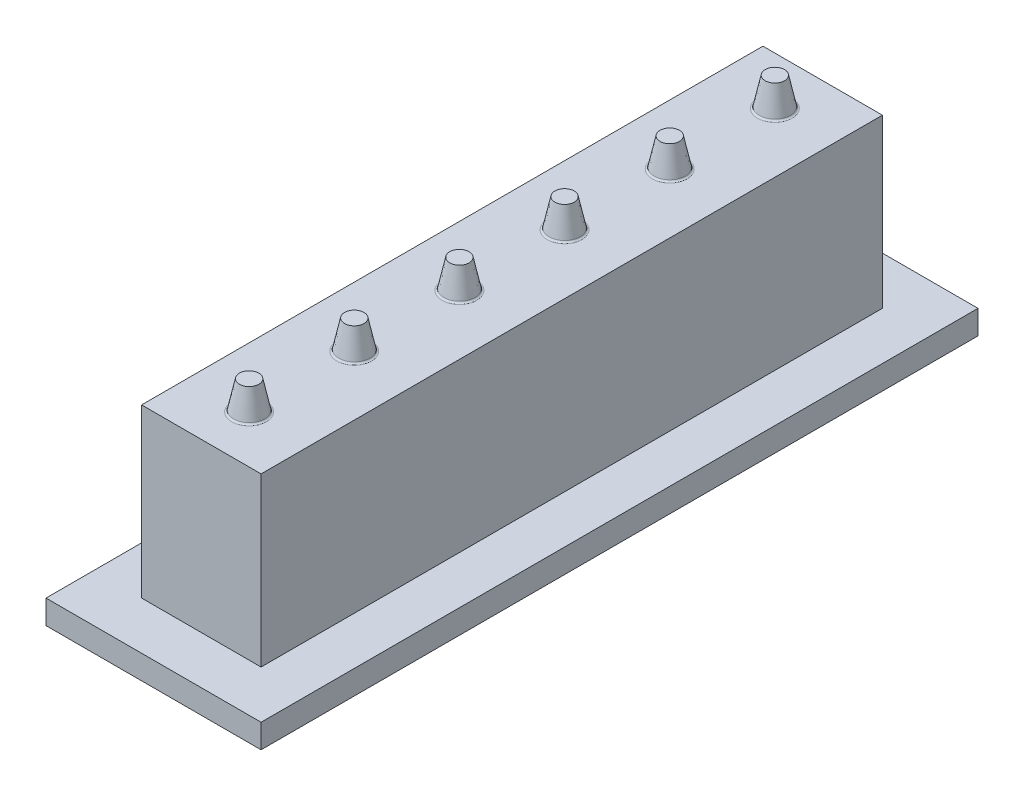
ISO-10303-21;
HEADER;
FILE_DESCRIPTION(('STEP AP214'),'2;1');
FILE_NAME('part.step','',(''),(''),'','','');
FILE_SCHEMA(('AUTOMOTIVE_DESIGN { 1 0 10303 214 1 1 1 1 }'));
ENDSEC;
DATA;
#1=APPLICATION_CONTEXT('core data for automotive mechanical design processes');
#2=APPLICATION_PROTOCOL_DEFINITION('international standard','automotive_design',2000,#1);
#3=PRODUCT_CONTEXT('',#1,'mechanical');
#4=PRODUCT('Part','Part','',(#3));
#5=PRODUCT_RELATED_PRODUCT_CATEGORY('part','',(#4));
#6=PRODUCT_DEFINITION_FORMATION('','',#4);
#7=PRODUCT_DEFINITION_CONTEXT('part definition',#1,'design');
#8=PRODUCT_DEFINITION('design','',#6,#7);
#9=PRODUCT_DEFINITION_SHAPE('','',#8);
#10=(LENGTH_UNIT() NAMED_UNIT(*) SI_UNIT(.MILLI.,.METRE.));
#11=(NAMED_UNIT(*) PLANE_ANGLE_UNIT() SI_UNIT($,.RADIAN.));
#12=(NAMED_UNIT(*) SI_UNIT($,.STERADIAN.) SOLID_ANGLE_UNIT());
#13=UNCERTAINTY_MEASURE_WITH_UNIT(LENGTH_MEASURE(1.E-05),#10,'distance_accuracy_value','');
#14=(GEOMETRIC_REPRESENTATION_CONTEXT(3) GLOBAL_UNCERTAINTY_ASSIGNED_CONTEXT((#13)) GLOBAL_UNIT_ASSIGNED_CONTEXT((#10,
#11,#12)) REPRESENTATION_CONTEXT('',''));
#15=CARTESIAN_POINT('',(0.,0.,0.));
#16=DIRECTION('',(0.,0.,1.));
#17=DIRECTION('',(1.,0.,0.));
#18=AXIS2_PLACEMENT_3D('',#15,#16,#17);
#19=CARTESIAN_POINT('',(0.,0.,165.1));
#20=DIRECTION('',(1.,0.,0.));
#21=DIRECTION('',(0.,0.,-1.));
#22=AXIS2_PLACEMENT_3D('',#19,#20,#21);
#23=PLANE('',#22);
#24=DIRECTION('',(0.,-1.,0.));
#25=VECTOR('',#24,1.);
#26=CARTESIAN_POINT('',(0.,0.,0.));
#27=LINE('',#26,#25);
#28=CARTESIAN_POINT('',(0.,50.8,0.));
#29=VERTEX_POINT('',#28);
#30=CARTESIAN_POINT('',(0.,6.35,0.));
#31=VERTEX_POINT('',#30);
#32=EDGE_CURVE('E219',#29,#31,#27,.T.);
#33=ORIENTED_EDGE('',*,*,#32,.T.);
#34=DIRECTION('',(0.,0.,-1.));
#35=VECTOR('',#34,1.);
#36=CARTESIAN_POINT('',(0.,6.35,0.));
#37=LINE('',#36,#35);
#38=CARTESIAN_POINT('',(0.,6.35,165.1));
#39=VERTEX_POINT('',#38);
#40=EDGE_CURVE('E57',#39,#31,#37,.T.);
#41=ORIENTED_EDGE('',*,*,#40,.F.);
#42=DIRECTION('',(0.,-1.,0.));
#43=VECTOR('',#42,1.);
#44=CARTESIAN_POINT('',(0.,0.,165.1));
#45=LINE('',#44,#43);
#46=CARTESIAN_POINT('',(0.,50.8,165.1));
#47=VERTEX_POINT('',#46);
#48=EDGE_CURVE('E220',#47,#39,#45,.T.);
#49=ORIENTED_EDGE('',*,*,#48,.F.);
#50=DIRECTION('',(0.,0.,-1.));
#51=VECTOR('',#50,1.);
#52=CARTESIAN_POINT('',(0.,50.8,165.1));
#53=LINE('',#52,#51);
#54=EDGE_CURVE('E227',#47,#29,#53,.T.);
#55=ORIENTED_EDGE('',*,*,#54,.T.);
#56=EDGE_LOOP('',(#33,#41,#49,#55));
#57=FACE_BOUND('',#56,.T.);
#58=ADVANCED_FACE('F34',(#57),#23,.F.);
#59=CARTESIAN_POINT('',(31.75,0.,165.1));
#60=DIRECTION('',(-1.,0.,0.));
#61=DIRECTION('',(0.,0.,1.));
#62=AXIS2_PLACEMENT_3D('',#59,#60,#61);
#63=PLANE('',#62);
#64=DIRECTION('',(0.,1.,0.));
#65=VECTOR('',#64,1.);
#66=CARTESIAN_POINT('',(31.75,0.,165.1));
#67=LINE('',#66,#65);
#68=CARTESIAN_POINT('',(31.75,6.35,165.1));
#69=VERTEX_POINT('',#68);
#70=CARTESIAN_POINT('',(31.75,50.8,165.1));
#71=VERTEX_POINT('',#70);
#72=EDGE_CURVE('E222',#69,#71,#67,.T.);
#73=ORIENTED_EDGE('',*,*,#72,.F.);
#74=DIRECTION('',(0.,0.,1.));
#75=VECTOR('',#74,1.);
#76=CARTESIAN_POINT('',(31.75,6.35,0.));
#77=LINE('',#76,#75);
#78=CARTESIAN_POINT('',(31.75,6.35,0.));
#79=VERTEX_POINT('',#78);
#80=EDGE_CURVE('E385',#79,#69,#77,.T.);
#81=ORIENTED_EDGE('',*,*,#80,.F.);
#82=DIRECTION('',(0.,1.,0.));
#83=VECTOR('',#82,1.);
#84=CARTESIAN_POINT('',(31.75,0.,0.));
#85=LINE('',#84,#83);
#86=CARTESIAN_POINT('',(31.75,50.8,0.));
#87=VERTEX_POINT('',#86);
#88=EDGE_CURVE('E229',#79,#87,#85,.T.);
#89=ORIENTED_EDGE('',*,*,#88,.T.);
#90=DIRECTION('',(0.,0.,-1.));
#91=VECTOR('',#90,1.);
#92=CARTESIAN_POINT('',(31.75,50.8,165.1));
#93=LINE('',#92,#91);
#94=EDGE_CURVE('E234',#71,#87,#93,.T.);
#95=ORIENTED_EDGE('',*,*,#94,.F.);
#96=EDGE_LOOP('',(#73,#81,#89,#95));
#97=FACE_BOUND('',#96,.T.);
#98=ADVANCED_FACE('F286',(#97),#63,.F.);
#99=CARTESIAN_POINT('',(0.,50.8,165.1));
#100=DIRECTION('',(0.,-1.,0.));
#101=DIRECTION('',(0.,0.,-1.));
#102=AXIS2_PLACEMENT_3D('',#99,#100,#101);
#103=PLANE('',#102);
#104=CARTESIAN_POINT('',(15.875,50.8,124.46));
#105=DIRECTION('',(0.,-1.,0.));
#106=DIRECTION('',(0.,0.,-1.));
#107=AXIS2_PLACEMENT_3D('',#104,#105,#106);
#108=CIRCLE('',#107,4.60237028886307);
#109=CARTESIAN_POINT('',(15.875,50.8,119.857629711137));
#110=VERTEX_POINT('',#109);
#111=EDGE_CURVE('E255',#110,#110,#108,.T.);
#112=ORIENTED_EDGE('',*,*,#111,.T.);
#113=EDGE_LOOP('',(#112));
#114=FACE_BOUND('',#113,.T.);
#115=CARTESIAN_POINT('',(15.875,50.8,152.4));
#116=DIRECTION('',(0.,-1.,0.));
#117=DIRECTION('',(0.,0.,-1.));
#118=AXIS2_PLACEMENT_3D('',#115,#116,#117);
#119=CIRCLE('',#118,4.60237028886307);
#120=CARTESIAN_POINT('',(15.875,50.8,147.797629711137));
#121=VERTEX_POINT('',#120);
#122=EDGE_CURVE('E252',#121,#121,#119,.T.);
#123=ORIENTED_EDGE('',*,*,#122,.T.);
#124=EDGE_LOOP('',(#123));
#125=FACE_BOUND('',#124,.T.);
#126=CARTESIAN_POINT('',(15.875,50.8,96.52));
#127=DIRECTION('',(0.,-1.,0.));
#128=DIRECTION('',(0.,0.,-1.));
#129=AXIS2_PLACEMENT_3D('',#126,#127,#128);
#130=CIRCLE('',#129,4.60237028886307);
#131=CARTESIAN_POINT('',(15.875,50.8,91.9176297111369));
#132=VERTEX_POINT('',#131);
#133=EDGE_CURVE('E249',#132,#132,#130,.T.);
#134=ORIENTED_EDGE('',*,*,#133,.T.);
#135=EDGE_LOOP('',(#134));
#136=FACE_BOUND('',#135,.T.);
#137=CARTESIAN_POINT('',(15.875,50.8,68.58));
#138=DIRECTION('',(0.,-1.,0.));
#139=DIRECTION('',(0.,0.,-1.));
#140=AXIS2_PLACEMENT_3D('',#137,#138,#139);
#141=CIRCLE('',#140,4.60237028886306);
#142=CARTESIAN_POINT('',(15.875,50.8,63.9776297111369));
#143=VERTEX_POINT('',#142);
#144=EDGE_CURVE('E246',#143,#143,#141,.T.);
#145=ORIENTED_EDGE('',*,*,#144,.T.);
#146=EDGE_LOOP('',(#145));
#147=FACE_BOUND('',#146,.T.);
#148=CARTESIAN_POINT('',(15.875,50.8,40.64));
#149=DIRECTION('',(0.,-1.,0.));
#150=DIRECTION('',(0.,0.,-1.));
#151=AXIS2_PLACEMENT_3D('',#148,#149,#150);
#152=CIRCLE('',#151,4.60237028886306);
#153=CARTESIAN_POINT('',(15.875,50.8,36.0376297111369));
#154=VERTEX_POINT('',#153);
#155=EDGE_CURVE('E243',#154,#154,#152,.T.);
#156=ORIENTED_EDGE('',*,*,#155,.T.);
#157=EDGE_LOOP('',(#156));
#158=FACE_BOUND('',#157,.T.);
#159=CARTESIAN_POINT('',(15.875,50.8,12.7));
#160=DIRECTION('',(0.,-1.,0.));
#161=DIRECTION('',(0.,0.,-1.));
#162=AXIS2_PLACEMENT_3D('',#159,#160,#161);
#163=CIRCLE('',#162,4.60237028886306);
#164=CARTESIAN_POINT('',(15.875,50.8,8.09762971113694));
#165=VERTEX_POINT('',#164);
#166=EDGE_CURVE('E240',#165,#165,#163,.T.);
#167=ORIENTED_EDGE('',*,*,#166,.T.);
#168=EDGE_LOOP('',(#167));
#169=FACE_BOUND('',#168,.T.);
#170=DIRECTION('',(-1.,0.,0.));
#171=VECTOR('',#170,1.);
#172=CARTESIAN_POINT('',(0.,50.8,0.));
#173=LINE('',#172,#171);
#174=EDGE_CURVE('E223',#87,#29,#173,.T.);
#175=ORIENTED_EDGE('',*,*,#174,.T.);
#176=ORIENTED_EDGE('',*,*,#54,.F.);
#177=DIRECTION('',(-1.,0.,0.));
#178=VECTOR('',#177,1.);
#179=CARTESIAN_POINT('',(0.,50.8,165.1));
#180=LINE('',#179,#178);
#181=EDGE_CURVE('E225',#71,#47,#180,.T.);
#182=ORIENTED_EDGE('',*,*,#181,.F.);
#183=ORIENTED_EDGE('',*,*,#94,.T.);
#184=EDGE_LOOP('',(#175,#176,#182,#183));
#185=FACE_BOUND('',#184,.T.);
#186=ADVANCED_FACE('F291',(#114,#125,#136,#147,#158,#169,#185),#103,.F.);
#187=CARTESIAN_POINT('',(0.,0.,165.1));
#188=DIRECTION('',(0.,0.,-1.));
#189=DIRECTION('',(-1.,0.,0.));
#190=AXIS2_PLACEMENT_3D('',#187,#188,#189);
#191=PLANE('',#190);
#192=ORIENTED_EDGE('',*,*,#48,.T.);
#193=DIRECTION('',(-1.,0.,0.));
#194=VECTOR('',#193,1.);
#195=CARTESIAN_POINT('',(0.,6.35,165.1));
#196=LINE('',#195,#194);
#197=EDGE_CURVE('E49',#69,#39,#196,.T.);
#198=ORIENTED_EDGE('',*,*,#197,.F.);
#199=ORIENTED_EDGE('',*,*,#72,.T.);
#200=ORIENTED_EDGE('',*,*,#181,.T.);
#201=EDGE_LOOP('',(#192,#198,#199,#200));
#202=FACE_BOUND('',#201,.T.);
#203=ADVANCED_FACE('F355',(#202),#191,.F.);
#204=CARTESIAN_POINT('',(0.,0.,0.));
#205=DIRECTION('',(0.,0.,-1.));
#206=DIRECTION('',(-1.,0.,0.));
#207=AXIS2_PLACEMENT_3D('',#204,#205,#206);
#208=PLANE('',#207);
#209=DIRECTION('',(1.,0.,0.));
#210=VECTOR('',#209,1.);
#211=CARTESIAN_POINT('',(0.,6.35,0.));
#212=LINE('',#211,#210);
#213=EDGE_CURVE('E381',#31,#79,#212,.T.);
#214=ORIENTED_EDGE('',*,*,#213,.F.);
#215=ORIENTED_EDGE('',*,*,#32,.F.);
#216=ORIENTED_EDGE('',*,*,#174,.F.);
#217=ORIENTED_EDGE('',*,*,#88,.F.);
#218=EDGE_LOOP('',(#214,#215,#216,#217));
#219=FACE_BOUND('',#218,.T.);
#220=ADVANCED_FACE('F353',(#219),#208,.T.);
#221=CARTESIAN_POINT('',(15.875,50.8,12.7));
#222=DIRECTION('',(0.,-1.,0.));
#223=DIRECTION('',(0.,0.,1.));
#224=AXIS2_PLACEMENT_3D('',#221,#222,#223);
#225=CONICAL_SURFACE('',#224,4.191,0.20943951023932);
#226=CARTESIAN_POINT('',(15.875,51.2023808610646,12.7));
#227=DIRECTION('',(0.,-1.,0.));
#228=DIRECTION('',(0.,0.,-1.));
#229=AXIS2_PLACEMENT_3D('',#226,#227,#228);
#230=CIRCLE('',#229,4.10547130769029);
#231=CARTESIAN_POINT('',(15.875,51.2023808610646,8.59452869230971));
#232=VERTEX_POINT('',#231);
#233=EDGE_CURVE('E11',#232,#232,#230,.F.);
#234=ORIENTED_EDGE('',*,*,#233,.T.);
#235=EDGE_LOOP('',(#234));
#236=FACE_BOUND('',#235,.T.);
#237=CARTESIAN_POINT('',(15.875,58.42,12.7));
#238=DIRECTION('',(0.,1.,0.));
#239=DIRECTION('',(0.,0.,1.));
#240=AXIS2_PLACEMENT_3D('',#237,#238,#239);
#241=CIRCLE('',#240,2.57131900007443);
#242=CARTESIAN_POINT('',(15.875,58.42,15.2713190000744));
#243=VERTEX_POINT('',#242);
#244=EDGE_CURVE('E216',#243,#243,#241,.T.);
#245=ORIENTED_EDGE('',*,*,#244,.F.);
#246=EDGE_LOOP('',(#245));
#247=FACE_BOUND('',#246,.T.);
#248=ADVANCED_FACE('F349',(#236,#247),#225,.T.);
#249=CARTESIAN_POINT('',(15.875,58.42,12.7));
#250=DIRECTION('',(0.,1.,0.));
#251=DIRECTION('',(0.,0.,1.));
#252=AXIS2_PLACEMENT_3D('',#249,#250,#251);
#253=PLANE('',#252);
#254=ORIENTED_EDGE('',*,*,#244,.T.);
#255=EDGE_LOOP('',(#254));
#256=FACE_BOUND('',#255,.T.);
#257=ADVANCED_FACE('F346',(#256),#253,.T.);
#258=CARTESIAN_POINT('',(15.875,50.8,40.64));
#259=DIRECTION('',(0.,-1.,0.));
#260=DIRECTION('',(0.,0.,1.));
#261=AXIS2_PLACEMENT_3D('',#258,#259,#260);
#262=CONICAL_SURFACE('',#261,4.191,0.20943951023932);
#263=CARTESIAN_POINT('',(15.875,51.2023808610646,40.64));
#264=DIRECTION('',(0.,-1.,0.));
#265=DIRECTION('',(0.,0.,-1.));
#266=AXIS2_PLACEMENT_3D('',#263,#264,#265);
#267=CIRCLE('',#266,4.10547130769029);
#268=CARTESIAN_POINT('',(15.875,51.2023808610646,36.5345286923097));
#269=VERTEX_POINT('',#268);
#270=EDGE_CURVE('E42',#269,#269,#267,.F.);
#271=ORIENTED_EDGE('',*,*,#270,.T.);
#272=EDGE_LOOP('',(#271));
#273=FACE_BOUND('',#272,.T.);
#274=CARTESIAN_POINT('',(15.875,58.42,40.64));
#275=DIRECTION('',(0.,1.,0.));
#276=DIRECTION('',(0.,0.,1.));
#277=AXIS2_PLACEMENT_3D('',#274,#275,#276);
#278=CIRCLE('',#277,2.57131900007443);
#279=CARTESIAN_POINT('',(15.875,58.42,43.2113190000744));
#280=VERTEX_POINT('',#279);
#281=EDGE_CURVE('E213',#280,#280,#278,.T.);
#282=ORIENTED_EDGE('',*,*,#281,.F.);
#283=EDGE_LOOP('',(#282));
#284=FACE_BOUND('',#283,.T.);
#285=ADVANCED_FACE('F269',(#273,#284),#262,.T.);
#286=CARTESIAN_POINT('',(15.875,58.42,40.64));
#287=DIRECTION('',(0.,1.,0.));
#288=DIRECTION('',(0.,0.,1.));
#289=AXIS2_PLACEMENT_3D('',#286,#287,#288);
#290=PLANE('',#289);
#291=ORIENTED_EDGE('',*,*,#281,.T.);
#292=EDGE_LOOP('',(#291));
#293=FACE_BOUND('',#292,.T.);
#294=ADVANCED_FACE('F339',(#293),#290,.T.);
#295=CARTESIAN_POINT('',(15.875,50.8,68.58));
#296=DIRECTION('',(0.,-1.,0.));
#297=DIRECTION('',(0.,0.,1.));
#298=AXIS2_PLACEMENT_3D('',#295,#296,#297);
#299=CONICAL_SURFACE('',#298,4.191,0.20943951023932);
#300=CARTESIAN_POINT('',(15.875,51.2023808610646,68.58));
#301=DIRECTION('',(0.,-1.,0.));
#302=DIRECTION('',(0.,0.,-1.));
#303=AXIS2_PLACEMENT_3D('',#300,#301,#302);
#304=CIRCLE('',#303,4.10547130769029);
#305=CARTESIAN_POINT('',(15.875,51.2023808610646,64.4745286923097));
#306=VERTEX_POINT('',#305);
#307=EDGE_CURVE('E264',#306,#306,#304,.F.);
#308=ORIENTED_EDGE('',*,*,#307,.T.);
#309=EDGE_LOOP('',(#308));
#310=FACE_BOUND('',#309,.T.);
#311=CARTESIAN_POINT('',(15.875,58.42,68.58));
#312=DIRECTION('',(0.,1.,0.));
#313=DIRECTION('',(0.,0.,1.));
#314=AXIS2_PLACEMENT_3D('',#311,#312,#313);
#315=CIRCLE('',#314,2.57131900007443);
#316=CARTESIAN_POINT('',(15.875,58.42,71.1513190000744));
#317=VERTEX_POINT('',#316);
#318=EDGE_CURVE('E210',#317,#317,#315,.T.);
#319=ORIENTED_EDGE('',*,*,#318,.F.);
#320=EDGE_LOOP('',(#319));
#321=FACE_BOUND('',#320,.T.);
#322=ADVANCED_FACE('F335',(#310,#321),#299,.T.);
#323=CARTESIAN_POINT('',(15.875,58.42,68.58));
#324=DIRECTION('',(0.,1.,0.));
#325=DIRECTION('',(0.,0.,1.));
#326=AXIS2_PLACEMENT_3D('',#323,#324,#325);
#327=PLANE('',#326);
#328=ORIENTED_EDGE('',*,*,#318,.T.);
#329=EDGE_LOOP('',(#328));
#330=FACE_BOUND('',#329,.T.);
#331=ADVANCED_FACE('F318',(#330),#327,.T.);
#332=CARTESIAN_POINT('',(15.875,50.8,96.52));
#333=DIRECTION('',(0.,-1.,0.));
#334=DIRECTION('',(0.,0.,1.));
#335=AXIS2_PLACEMENT_3D('',#332,#333,#334);
#336=CONICAL_SURFACE('',#335,4.19100000000001,0.20943951023932);
#337=CARTESIAN_POINT('',(15.875,51.2023808610646,96.52));
#338=DIRECTION('',(0.,-1.,0.));
#339=DIRECTION('',(0.,0.,-1.));
#340=AXIS2_PLACEMENT_3D('',#337,#338,#339);
#341=CIRCLE('',#340,4.1054713076903);
#342=CARTESIAN_POINT('',(15.875,51.2023808610646,92.4145286923097));
#343=VERTEX_POINT('',#342);
#344=EDGE_CURVE('E261',#343,#343,#341,.F.);
#345=ORIENTED_EDGE('',*,*,#344,.T.);
#346=EDGE_LOOP('',(#345));
#347=FACE_BOUND('',#346,.T.);
#348=CARTESIAN_POINT('',(15.875,58.42,96.52));
#349=DIRECTION('',(0.,1.,0.));
#350=DIRECTION('',(0.,0.,1.));
#351=AXIS2_PLACEMENT_3D('',#348,#349,#350);
#352=CIRCLE('',#351,2.57131900007444);
#353=CARTESIAN_POINT('',(15.875,58.42,99.0913190000744));
#354=VERTEX_POINT('',#353);
#355=EDGE_CURVE('E207',#354,#354,#352,.T.);
#356=ORIENTED_EDGE('',*,*,#355,.F.);
#357=EDGE_LOOP('',(#356));
#358=FACE_BOUND('',#357,.T.);
#359=ADVANCED_FACE('F314',(#347,#358),#336,.T.);
#360=CARTESIAN_POINT('',(15.875,58.42,96.52));
#361=DIRECTION('',(0.,1.,0.));
#362=DIRECTION('',(0.,0.,1.));
#363=AXIS2_PLACEMENT_3D('',#360,#361,#362);
#364=PLANE('',#363);
#365=ORIENTED_EDGE('',*,*,#355,.T.);
#366=EDGE_LOOP('',(#365));
#367=FACE_BOUND('',#366,.T.);
#368=ADVANCED_FACE('F317',(#367),#364,.T.);
#369=CARTESIAN_POINT('',(15.875,50.8,124.46));
#370=DIRECTION('',(0.,-1.,0.));
#371=DIRECTION('',(0.,0.,1.));
#372=AXIS2_PLACEMENT_3D('',#369,#370,#371);
#373=CONICAL_SURFACE('',#372,4.19100000000001,0.20943951023932);
#374=CARTESIAN_POINT('',(15.875,51.2023808610646,124.46));
#375=DIRECTION('',(0.,-1.,0.));
#376=DIRECTION('',(0.,0.,-1.));
#377=AXIS2_PLACEMENT_3D('',#374,#375,#376);
#378=CIRCLE('',#377,4.10547130769029);
#379=CARTESIAN_POINT('',(15.875,51.2023808610646,120.35452869231));
#380=VERTEX_POINT('',#379);
#381=EDGE_CURVE('E237',#380,#380,#378,.F.);
#382=ORIENTED_EDGE('',*,*,#381,.T.);
#383=EDGE_LOOP('',(#382));
#384=FACE_BOUND('',#383,.T.);
#385=CARTESIAN_POINT('',(15.875,58.42,124.46));
#386=DIRECTION('',(0.,1.,0.));
#387=DIRECTION('',(0.,0.,1.));
#388=AXIS2_PLACEMENT_3D('',#385,#386,#387);
#389=CIRCLE('',#388,2.57131900007443);
#390=CARTESIAN_POINT('',(15.875,58.42,127.031319000074));
#391=VERTEX_POINT('',#390);
#392=EDGE_CURVE('E204',#391,#391,#389,.T.);
#393=ORIENTED_EDGE('',*,*,#392,.F.);
#394=EDGE_LOOP('',(#393));
#395=FACE_BOUND('',#394,.T.);
#396=ADVANCED_FACE('F323',(#384,#395),#373,.T.);
#397=CARTESIAN_POINT('',(15.875,58.42,124.46));
#398=DIRECTION('',(0.,1.,0.));
#399=DIRECTION('',(0.,0.,1.));
#400=AXIS2_PLACEMENT_3D('',#397,#398,#399);
#401=PLANE('',#400);
#402=ORIENTED_EDGE('',*,*,#392,.T.);
#403=EDGE_LOOP('',(#402));
#404=FACE_BOUND('',#403,.T.);
#405=ADVANCED_FACE('F328',(#404),#401,.T.);
#406=CARTESIAN_POINT('',(15.875,50.8,152.4));
#407=DIRECTION('',(0.,-1.,0.));
#408=DIRECTION('',(0.,0.,1.));
#409=AXIS2_PLACEMENT_3D('',#406,#407,#408);
#410=CONICAL_SURFACE('',#409,4.19100000000001,0.20943951023932);
#411=CARTESIAN_POINT('',(15.875,51.2023808610646,152.4));
#412=DIRECTION('',(0.,-1.,0.));
#413=DIRECTION('',(0.,0.,-1.));
#414=AXIS2_PLACEMENT_3D('',#411,#412,#413);
#415=CIRCLE('',#414,4.1054713076903);
#416=CARTESIAN_POINT('',(15.875,51.2023808610646,148.29452869231));
#417=VERTEX_POINT('',#416);
#418=EDGE_CURVE('E258',#417,#417,#415,.F.);
#419=ORIENTED_EDGE('',*,*,#418,.T.);
#420=EDGE_LOOP('',(#419));
#421=FACE_BOUND('',#420,.T.);
#422=CARTESIAN_POINT('',(15.875,58.42,152.4));
#423=DIRECTION('',(0.,1.,0.));
#424=DIRECTION('',(0.,0.,1.));
#425=AXIS2_PLACEMENT_3D('',#422,#423,#424);
#426=CIRCLE('',#425,2.57131900007444);
#427=CARTESIAN_POINT('',(15.875,58.42,154.971319000074));
#428=VERTEX_POINT('',#427);
#429=EDGE_CURVE('E195',#428,#428,#426,.T.);
#430=ORIENTED_EDGE('',*,*,#429,.F.);
#431=EDGE_LOOP('',(#430));
#432=FACE_BOUND('',#431,.T.);
#433=ADVANCED_FACE('F427',(#421,#432),#410,.T.);
#434=CARTESIAN_POINT('',(15.875,58.42,152.4));
#435=DIRECTION('',(0.,1.,0.));
#436=DIRECTION('',(0.,0.,1.));
#437=AXIS2_PLACEMENT_3D('',#434,#435,#436);
#438=PLANE('',#437);
#439=ORIENTED_EDGE('',*,*,#429,.T.);
#440=EDGE_LOOP('',(#439));
#441=FACE_BOUND('',#440,.T.);
#442=ADVANCED_FACE('F301',(#441),#438,.T.);
#443=CARTESIAN_POINT('',(15.875,51.308,124.46));
#444=DIRECTION('',(0.,-1.,0.));
#445=DIRECTION('',(0.,0.,-1.));
#446=AXIS2_PLACEMENT_3D('',#443,#444,#445);
#447=TOROIDAL_SURFACE('',#446,4.60237028886307,0.508);
#448=ORIENTED_EDGE('',*,*,#111,.F.);
#449=EDGE_LOOP('',(#448));
#450=FACE_BOUND('',#449,.T.);
#451=ORIENTED_EDGE('',*,*,#381,.F.);
#452=EDGE_LOOP('',(#451));
#453=FACE_BOUND('',#452,.T.);
#454=ADVANCED_FACE('F297',(#450,#453),#447,.F.);
#455=CARTESIAN_POINT('',(15.875,51.308,152.4));
#456=DIRECTION('',(0.,-1.,0.));
#457=DIRECTION('',(0.,0.,-1.));
#458=AXIS2_PLACEMENT_3D('',#455,#456,#457);
#459=TOROIDAL_SURFACE('',#458,4.60237028886307,0.508);
#460=ORIENTED_EDGE('',*,*,#122,.F.);
#461=EDGE_LOOP('',(#460));
#462=FACE_BOUND('',#461,.T.);
#463=ORIENTED_EDGE('',*,*,#418,.F.);
#464=EDGE_LOOP('',(#463));
#465=FACE_BOUND('',#464,.T.);
#466=ADVANCED_FACE('F300',(#462,#465),#459,.F.);
#467=CARTESIAN_POINT('',(15.875,51.308,96.52));
#468=DIRECTION('',(0.,-1.,0.));
#469=DIRECTION('',(0.,0.,-1.));
#470=AXIS2_PLACEMENT_3D('',#467,#468,#469);
#471=TOROIDAL_SURFACE('',#470,4.60237028886307,0.508);
#472=ORIENTED_EDGE('',*,*,#133,.F.);
#473=EDGE_LOOP('',(#472));
#474=FACE_BOUND('',#473,.T.);
#475=ORIENTED_EDGE('',*,*,#344,.F.);
#476=EDGE_LOOP('',(#475));
#477=FACE_BOUND('',#476,.T.);
#478=ADVANCED_FACE('F281',(#474,#477),#471,.F.);
#479=CARTESIAN_POINT('',(15.875,51.308,68.58));
#480=DIRECTION('',(0.,-1.,0.));
#481=DIRECTION('',(0.,0.,-1.));
#482=AXIS2_PLACEMENT_3D('',#479,#480,#481);
#483=TOROIDAL_SURFACE('',#482,4.60237028886306,0.508);
#484=ORIENTED_EDGE('',*,*,#144,.F.);
#485=EDGE_LOOP('',(#484));
#486=FACE_BOUND('',#485,.T.);
#487=ORIENTED_EDGE('',*,*,#307,.F.);
#488=EDGE_LOOP('',(#487));
#489=FACE_BOUND('',#488,.T.);
#490=ADVANCED_FACE('F274',(#486,#489),#483,.F.);
#491=CARTESIAN_POINT('',(15.875,51.308,40.64));
#492=DIRECTION('',(0.,-1.,0.));
#493=DIRECTION('',(0.,0.,-1.));
#494=AXIS2_PLACEMENT_3D('',#491,#492,#493);
#495=TOROIDAL_SURFACE('',#494,4.60237028886306,0.508);
#496=ORIENTED_EDGE('',*,*,#155,.F.);
#497=EDGE_LOOP('',(#496));
#498=FACE_BOUND('',#497,.T.);
#499=ORIENTED_EDGE('',*,*,#270,.F.);
#500=EDGE_LOOP('',(#499));
#501=FACE_BOUND('',#500,.T.);
#502=ADVANCED_FACE('F272',(#498,#501),#495,.F.);
#503=CARTESIAN_POINT('',(15.875,51.308,12.7));
#504=DIRECTION('',(0.,-1.,0.));
#505=DIRECTION('',(0.,0.,-1.));
#506=AXIS2_PLACEMENT_3D('',#503,#504,#505);
#507=TOROIDAL_SURFACE('',#506,4.60237028886306,0.508);
#508=ORIENTED_EDGE('',*,*,#166,.F.);
#509=EDGE_LOOP('',(#508));
#510=FACE_BOUND('',#509,.T.);
#511=ORIENTED_EDGE('',*,*,#233,.F.);
#512=EDGE_LOOP('',(#511));
#513=FACE_BOUND('',#512,.T.);
#514=ADVANCED_FACE('F36',(#510,#513),#507,.F.);
#515=CARTESIAN_POINT('',(-12.7,6.35,-12.7));
#516=DIRECTION('',(-1.,0.,0.));
#517=DIRECTION('',(0.,0.,1.));
#518=AXIS2_PLACEMENT_3D('',#515,#516,#517);
#519=PLANE('',#518);
#520=DIRECTION('',(0.,0.,-1.));
#521=VECTOR('',#520,1.);
#522=CARTESIAN_POINT('',(-12.7,0.,-12.7));
#523=LINE('',#522,#521);
#524=CARTESIAN_POINT('',(-12.7,0.,177.8));
#525=VERTEX_POINT('',#524);
#526=CARTESIAN_POINT('',(-12.7,0.,-12.7));
#527=VERTEX_POINT('',#526);
#528=EDGE_CURVE('E160',#525,#527,#523,.T.);
#529=ORIENTED_EDGE('',*,*,#528,.F.);
#530=DIRECTION('',(0.,-1.,0.));
#531=VECTOR('',#530,1.);
#532=CARTESIAN_POINT('',(-12.7,6.35,177.8));
#533=LINE('',#532,#531);
#534=CARTESIAN_POINT('',(-12.7,6.35,177.8));
#535=VERTEX_POINT('',#534);
#536=EDGE_CURVE('E149',#535,#525,#533,.T.);
#537=ORIENTED_EDGE('',*,*,#536,.F.);
#538=DIRECTION('',(0.,0.,-1.));
#539=VECTOR('',#538,1.);
#540=CARTESIAN_POINT('',(-12.7,6.35,-12.7));
#541=LINE('',#540,#539);
#542=CARTESIAN_POINT('',(-12.7,6.35,-12.7));
#543=VERTEX_POINT('',#542);
#544=EDGE_CURVE('E143',#535,#543,#541,.T.);
#545=ORIENTED_EDGE('',*,*,#544,.T.);
#546=DIRECTION('',(0.,-1.,0.));
#547=VECTOR('',#546,1.);
#548=CARTESIAN_POINT('',(-12.7,6.35,-12.7));
#549=LINE('',#548,#547);
#550=EDGE_CURVE('E125',#543,#527,#549,.T.);
#551=ORIENTED_EDGE('',*,*,#550,.T.);
#552=EDGE_LOOP('',(#529,#537,#545,#551));
#553=FACE_BOUND('',#552,.T.);
#554=ADVANCED_FACE('F148',(#553),#519,.T.);
#555=CARTESIAN_POINT('',(-12.7,6.35,177.8));
#556=DIRECTION('',(0.,0.,1.));
#557=DIRECTION('',(1.,0.,0.));
#558=AXIS2_PLACEMENT_3D('',#555,#556,#557);
#559=PLANE('',#558);
#560=DIRECTION('',(-1.,0.,0.));
#561=VECTOR('',#560,1.);
#562=CARTESIAN_POINT('',(-12.7,0.,177.8));
#563=LINE('',#562,#561);
#564=CARTESIAN_POINT('',(44.45,0.,177.8));
#565=VERTEX_POINT('',#564);
#566=EDGE_CURVE('E150',#565,#525,#563,.T.);
#567=ORIENTED_EDGE('',*,*,#566,.F.);
#568=DIRECTION('',(0.,-1.,0.));
#569=VECTOR('',#568,1.);
#570=CARTESIAN_POINT('',(44.45,6.35,177.8));
#571=LINE('',#570,#569);
#572=CARTESIAN_POINT('',(44.45,6.35,177.8));
#573=VERTEX_POINT('',#572);
#574=EDGE_CURVE('E167',#573,#565,#571,.T.);
#575=ORIENTED_EDGE('',*,*,#574,.F.);
#576=DIRECTION('',(-1.,0.,0.));
#577=VECTOR('',#576,1.);
#578=CARTESIAN_POINT('',(-12.7,6.35,177.8));
#579=LINE('',#578,#577);
#580=EDGE_CURVE('E136',#573,#535,#579,.T.);
#581=ORIENTED_EDGE('',*,*,#580,.T.);
#582=ORIENTED_EDGE('',*,*,#536,.T.);
#583=EDGE_LOOP('',(#567,#575,#581,#582));
#584=FACE_BOUND('',#583,.T.);
#585=ADVANCED_FACE('F401',(#584),#559,.T.);
#586=CARTESIAN_POINT('',(44.45,6.35,-12.7));
#587=DIRECTION('',(1.,0.,0.));
#588=DIRECTION('',(0.,0.,-1.));
#589=AXIS2_PLACEMENT_3D('',#586,#587,#588);
#590=PLANE('',#589);
#591=DIRECTION('',(0.,0.,1.));
#592=VECTOR('',#591,1.);
#593=CARTESIAN_POINT('',(44.45,0.,-12.7));
#594=LINE('',#593,#592);
#595=CARTESIAN_POINT('',(44.45,0.,-12.7));
#596=VERTEX_POINT('',#595);
#597=EDGE_CURVE('E153',#596,#565,#594,.T.);
#598=ORIENTED_EDGE('',*,*,#597,.F.);
#599=DIRECTION('',(0.,-1.,0.));
#600=VECTOR('',#599,1.);
#601=CARTESIAN_POINT('',(44.45,6.35,-12.7));
#602=LINE('',#601,#600);
#603=CARTESIAN_POINT('',(44.45,6.35,-12.7));
#604=VERTEX_POINT('',#603);
#605=EDGE_CURVE('E135',#604,#596,#602,.T.);
#606=ORIENTED_EDGE('',*,*,#605,.F.);
#607=DIRECTION('',(0.,0.,1.));
#608=VECTOR('',#607,1.);
#609=CARTESIAN_POINT('',(44.45,6.35,-12.7));
#610=LINE('',#609,#608);
#611=EDGE_CURVE('E146',#604,#573,#610,.T.);
#612=ORIENTED_EDGE('',*,*,#611,.T.);
#613=ORIENTED_EDGE('',*,*,#574,.T.);
#614=EDGE_LOOP('',(#598,#606,#612,#613));
#615=FACE_BOUND('',#614,.T.);
#616=ADVANCED_FACE('F398',(#615),#590,.T.);
#617=CARTESIAN_POINT('',(-12.7,6.35,-12.7));
#618=DIRECTION('',(0.,0.,-1.));
#619=DIRECTION('',(-1.,0.,0.));
#620=AXIS2_PLACEMENT_3D('',#617,#618,#619);
#621=PLANE('',#620);
#622=DIRECTION('',(1.,0.,0.));
#623=VECTOR('',#622,1.);
#624=CARTESIAN_POINT('',(-12.7,0.,-12.7));
#625=LINE('',#624,#623);
#626=EDGE_CURVE('E130',#527,#596,#625,.T.);
#627=ORIENTED_EDGE('',*,*,#626,.F.);
#628=ORIENTED_EDGE('',*,*,#550,.F.);
#629=DIRECTION('',(1.,0.,0.));
#630=VECTOR('',#629,1.);
#631=CARTESIAN_POINT('',(-12.7,6.35,-12.7));
#632=LINE('',#631,#630);
#633=EDGE_CURVE('E128',#543,#604,#632,.T.);
#634=ORIENTED_EDGE('',*,*,#633,.T.);
#635=ORIENTED_EDGE('',*,*,#605,.T.);
#636=EDGE_LOOP('',(#627,#628,#634,#635));
#637=FACE_BOUND('',#636,.T.);
#638=ADVANCED_FACE('F127',(#637),#621,.T.);
#639=CARTESIAN_POINT('',(0.,6.35,0.));
#640=DIRECTION('',(0.,1.,0.));
#641=DIRECTION('',(0.,0.,1.));
#642=AXIS2_PLACEMENT_3D('',#639,#640,#641);
#643=PLANE('',#642);
#644=ORIENTED_EDGE('',*,*,#40,.T.);
#645=ORIENTED_EDGE('',*,*,#213,.T.);
#646=ORIENTED_EDGE('',*,*,#80,.T.);
#647=ORIENTED_EDGE('',*,*,#197,.T.);
#648=EDGE_LOOP('',(#644,#645,#646,#647));
#649=FACE_BOUND('',#648,.T.);
#650=ORIENTED_EDGE('',*,*,#544,.F.);
#651=ORIENTED_EDGE('',*,*,#580,.F.);
#652=ORIENTED_EDGE('',*,*,#611,.F.);
#653=ORIENTED_EDGE('',*,*,#633,.F.);
#654=EDGE_LOOP('',(#650,#651,#652,#653));
#655=FACE_BOUND('',#654,.T.);
#656=ADVANCED_FACE('F141',(#649,#655),#643,.T.);
#657=CARTESIAN_POINT('',(0.,44.45,0.));
#658=DIRECTION('',(0.,1.,0.));
#659=DIRECTION('',(0.,0.,1.));
#660=AXIS2_PLACEMENT_3D('',#657,#658,#659);
#661=PLANE('',#660);
#662=DIRECTION('',(0.,0.,-1.));
#663=VECTOR('',#662,1.);
#664=CARTESIAN_POINT('',(6.35,44.45,6.35));
#665=LINE('',#664,#663);
#666=CARTESIAN_POINT('',(6.34999999999998,44.45,158.75));
#667=VERTEX_POINT('',#666);
#668=CARTESIAN_POINT('',(6.35,44.45,6.35));
#669=VERTEX_POINT('',#668);
#670=EDGE_CURVE('E170',#667,#669,#665,.T.);
#671=ORIENTED_EDGE('',*,*,#670,.T.);
#672=DIRECTION('',(1.,0.,0.));
#673=VECTOR('',#672,1.);
#674=CARTESIAN_POINT('',(6.35,44.45,6.35));
#675=LINE('',#674,#673);
#676=CARTESIAN_POINT('',(25.4,44.45,6.35));
#677=VERTEX_POINT('',#676);
#678=EDGE_CURVE('E173',#669,#677,#675,.T.);
#679=ORIENTED_EDGE('',*,*,#678,.T.);
#680=DIRECTION('',(0.,0.,1.));
#681=VECTOR('',#680,1.);
#682=CARTESIAN_POINT('',(25.4,44.45,6.35));
#683=LINE('',#682,#681);
#684=CARTESIAN_POINT('',(25.4,44.45,158.75));
#685=VERTEX_POINT('',#684);
#686=EDGE_CURVE('E177',#677,#685,#683,.T.);
#687=ORIENTED_EDGE('',*,*,#686,.T.);
#688=DIRECTION('',(-1.,0.,0.));
#689=VECTOR('',#688,1.);
#690=CARTESIAN_POINT('',(6.34999999999998,44.45,158.75));
#691=LINE('',#690,#689);
#692=EDGE_CURVE('E180',#685,#667,#691,.T.);
#693=ORIENTED_EDGE('',*,*,#692,.T.);
#694=EDGE_LOOP('',(#671,#679,#687,#693));
#695=FACE_BOUND('',#694,.T.);
#696=ADVANCED_FACE('F389',(#695),#661,.F.);
#697=CARTESIAN_POINT('',(25.4,44.45,6.35));
#698=DIRECTION('',(1.,0.,0.));
#699=DIRECTION('',(0.,0.,-1.));
#700=AXIS2_PLACEMENT_3D('',#697,#698,#699);
#701=PLANE('',#700);
#702=DIRECTION('',(0.,0.,1.));
#703=VECTOR('',#702,1.);
#704=CARTESIAN_POINT('',(25.4,0.,6.35));
#705=LINE('',#704,#703);
#706=CARTESIAN_POINT('',(25.4,0.,6.35));
#707=VERTEX_POINT('',#706);
#708=CARTESIAN_POINT('',(25.4,0.,158.75));
#709=VERTEX_POINT('',#708);
#710=EDGE_CURVE('E188',#707,#709,#705,.T.);
#711=ORIENTED_EDGE('',*,*,#710,.T.);
#712=DIRECTION('',(0.,-1.,0.));
#713=VECTOR('',#712,1.);
#714=CARTESIAN_POINT('',(25.4,44.45,158.75));
#715=LINE('',#714,#713);
#716=EDGE_CURVE('E196',#685,#709,#715,.T.);
#717=ORIENTED_EDGE('',*,*,#716,.F.);
#718=ORIENTED_EDGE('',*,*,#686,.F.);
#719=DIRECTION('',(0.,-1.,0.));
#720=VECTOR('',#719,1.);
#721=CARTESIAN_POINT('',(25.4,44.45,6.35));
#722=LINE('',#721,#720);
#723=EDGE_CURVE('E198',#677,#707,#722,.T.);
#724=ORIENTED_EDGE('',*,*,#723,.T.);
#725=EDGE_LOOP('',(#711,#717,#718,#724));
#726=FACE_BOUND('',#725,.T.);
#727=ADVANCED_FACE('F395',(#726),#701,.F.);
#728=CARTESIAN_POINT('',(6.34999999999998,44.45,158.75));
#729=DIRECTION('',(0.,0.,1.));
#730=DIRECTION('',(1.,0.,0.));
#731=AXIS2_PLACEMENT_3D('',#728,#729,#730);
#732=PLANE('',#731);
#733=DIRECTION('',(-1.,0.,0.));
#734=VECTOR('',#733,1.);
#735=CARTESIAN_POINT('',(6.34999999999998,0.,158.75));
#736=LINE('',#735,#734);
#737=CARTESIAN_POINT('',(6.34999999999998,0.,158.75));
#738=VERTEX_POINT('',#737);
#739=EDGE_CURVE('E174',#709,#738,#736,.T.);
#740=ORIENTED_EDGE('',*,*,#739,.T.);
#741=DIRECTION('',(0.,-1.,0.));
#742=VECTOR('',#741,1.);
#743=CARTESIAN_POINT('',(6.34999999999998,44.45,158.75));
#744=LINE('',#743,#742);
#745=EDGE_CURVE('E193',#667,#738,#744,.T.);
#746=ORIENTED_EDGE('',*,*,#745,.F.);
#747=ORIENTED_EDGE('',*,*,#692,.F.);
#748=ORIENTED_EDGE('',*,*,#716,.T.);
#749=EDGE_LOOP('',(#740,#746,#747,#748));
#750=FACE_BOUND('',#749,.T.);
#751=ADVANCED_FACE('F410',(#750),#732,.F.);
#752=CARTESIAN_POINT('',(6.35,44.45,6.35));
#753=DIRECTION('',(-1.,0.,0.));
#754=DIRECTION('',(0.,0.,1.));
#755=AXIS2_PLACEMENT_3D('',#752,#753,#754);
#756=PLANE('',#755);
#757=DIRECTION('',(0.,0.,-1.));
#758=VECTOR('',#757,1.);
#759=CARTESIAN_POINT('',(6.35,0.,6.35));
#760=LINE('',#759,#758);
#761=CARTESIAN_POINT('',(6.35,0.,6.35));
#762=VERTEX_POINT('',#761);
#763=EDGE_CURVE('E166',#738,#762,#760,.T.);
#764=ORIENTED_EDGE('',*,*,#763,.T.);
#765=DIRECTION('',(0.,-1.,0.));
#766=VECTOR('',#765,1.);
#767=CARTESIAN_POINT('',(6.35,44.45,6.35));
#768=LINE('',#767,#766);
#769=EDGE_CURVE('E183',#669,#762,#768,.T.);
#770=ORIENTED_EDGE('',*,*,#769,.F.);
#771=ORIENTED_EDGE('',*,*,#670,.F.);
#772=ORIENTED_EDGE('',*,*,#745,.T.);
#773=EDGE_LOOP('',(#764,#770,#771,#772));
#774=FACE_BOUND('',#773,.T.);
#775=ADVANCED_FACE('F413',(#774),#756,.F.);
#776=CARTESIAN_POINT('',(6.35,44.45,6.35));
#777=DIRECTION('',(0.,0.,-1.));
#778=DIRECTION('',(-1.,0.,0.));
#779=AXIS2_PLACEMENT_3D('',#776,#777,#778);
#780=PLANE('',#779);
#781=DIRECTION('',(1.,0.,0.));
#782=VECTOR('',#781,1.);
#783=CARTESIAN_POINT('',(6.35,0.,6.35));
#784=LINE('',#783,#782);
#785=EDGE_CURVE('E185',#762,#707,#784,.T.);
#786=ORIENTED_EDGE('',*,*,#785,.T.);
#787=ORIENTED_EDGE('',*,*,#723,.F.);
#788=ORIENTED_EDGE('',*,*,#678,.F.);
#789=ORIENTED_EDGE('',*,*,#769,.T.);
#790=EDGE_LOOP('',(#786,#787,#788,#789));
#791=FACE_BOUND('',#790,.T.);
#792=ADVANCED_FACE('F418',(#791),#780,.F.);
#793=CARTESIAN_POINT('',(0.,0.,165.1));
#794=DIRECTION('',(0.,1.,0.));
#795=DIRECTION('',(0.,0.,1.));
#796=AXIS2_PLACEMENT_3D('',#793,#794,#795);
#797=PLANE('',#796);
#798=ORIENTED_EDGE('',*,*,#785,.F.);
#799=ORIENTED_EDGE('',*,*,#763,.F.);
#800=ORIENTED_EDGE('',*,*,#739,.F.);
#801=ORIENTED_EDGE('',*,*,#710,.F.);
#802=EDGE_LOOP('',(#798,#799,#800,#801));
#803=FACE_BOUND('',#802,.T.);
#804=ORIENTED_EDGE('',*,*,#528,.T.);
#805=ORIENTED_EDGE('',*,*,#626,.T.);
#806=ORIENTED_EDGE('',*,*,#597,.T.);
#807=ORIENTED_EDGE('',*,*,#566,.T.);
#808=EDGE_LOOP('',(#804,#805,#806,#807));
#809=FACE_BOUND('',#808,.T.);
#810=ADVANCED_FACE('F296',(#803,#809),#797,.F.);
#811=CLOSED_SHELL('',(#58,#98,#186,#203,#220,#248,#257,#285,#294,#322,#331,#359,#368,#396,#405,
#433,#442,#454,#466,#478,#490,#502,#514,#554,#585,#616,#638,#656,#696,#727,#751,#775,#792,#810));
#812=MANIFOLD_SOLID_BREP('B2',#811);
#813=ADVANCED_BREP_SHAPE_REPRESENTATION('',(#18,#812),#14);
#814=SHAPE_DEFINITION_REPRESENTATION(#9,#813);
ENDSEC;
END-ISO-10303-21;
